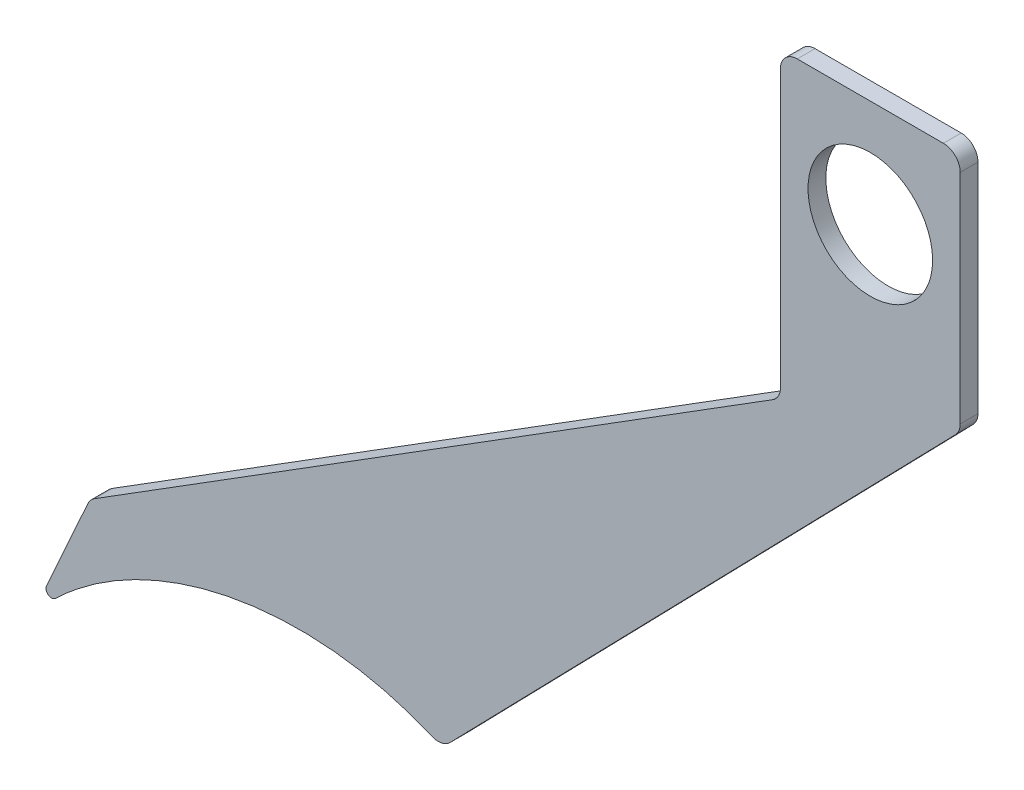
ISO-10303-21;
HEADER;
FILE_DESCRIPTION(('STEP AP214'),'2;1');
FILE_NAME('part.step','',(''),(''),'','','');
FILE_SCHEMA(('AUTOMOTIVE_DESIGN { 1 0 10303 214 1 1 1 1 }'));
ENDSEC;
DATA;
#1=APPLICATION_CONTEXT('core data for automotive mechanical design processes');
#2=APPLICATION_PROTOCOL_DEFINITION('international standard','automotive_design',2000,#1);
#3=PRODUCT_CONTEXT('',#1,'mechanical');
#4=PRODUCT('Part','Part','',(#3));
#5=PRODUCT_RELATED_PRODUCT_CATEGORY('part','',(#4));
#6=PRODUCT_DEFINITION_FORMATION('','',#4);
#7=PRODUCT_DEFINITION_CONTEXT('part definition',#1,'design');
#8=PRODUCT_DEFINITION('design','',#6,#7);
#9=PRODUCT_DEFINITION_SHAPE('','',#8);
#10=(LENGTH_UNIT() NAMED_UNIT(*) SI_UNIT(.MILLI.,.METRE.));
#11=(NAMED_UNIT(*) PLANE_ANGLE_UNIT() SI_UNIT($,.RADIAN.));
#12=(NAMED_UNIT(*) SI_UNIT($,.STERADIAN.) SOLID_ANGLE_UNIT());
#13=UNCERTAINTY_MEASURE_WITH_UNIT(LENGTH_MEASURE(1.E-05),#10,'distance_accuracy_value','');
#14=(GEOMETRIC_REPRESENTATION_CONTEXT(3) GLOBAL_UNCERTAINTY_ASSIGNED_CONTEXT((#13)) GLOBAL_UNIT_ASSIGNED_CONTEXT((#10,
#11,#12)) REPRESENTATION_CONTEXT('',''));
#15=CARTESIAN_POINT('',(0.,0.,0.));
#16=DIRECTION('',(0.,0.,1.));
#17=DIRECTION('',(1.,0.,0.));
#18=AXIS2_PLACEMENT_3D('',#15,#16,#17);
#19=CARTESIAN_POINT('',(-175.428063611577,170.729751924111,3.175));
#20=DIRECTION('',(-0.716638154781064,0.697445162799193,0.));
#21=DIRECTION('',(-0.697445162799193,-0.716638154781064,0.));
#22=AXIS2_PLACEMENT_3D('',#19,#20,#21);
#23=PLANE('',#22);
#24=DIRECTION('',(0.697445162799193,0.716638154781064,0.));
#25=VECTOR('',#24,1.);
#26=CARTESIAN_POINT('',(-175.428063611577,170.729751924111,3.175));
#27=LINE('',#26,#25);
#28=CARTESIAN_POINT('',(-455.954665330808,-117.516660763325,3.175));
#29=VERTEX_POINT('',#28);
#30=CARTESIAN_POINT('',(-365.814715468993,-24.8961498090788,3.175));
#31=VERTEX_POINT('',#30);
#32=EDGE_CURVE('E307',#29,#31,#27,.T.);
#33=ORIENTED_EDGE('',*,*,#32,.F.);
#34=DIRECTION('',(0.,0.,1.));
#35=VECTOR('',#34,1.);
#36=CARTESIAN_POINT('',(-455.954665330808,-117.516660763325,0.));
#37=LINE('',#36,#35);
#38=CARTESIAN_POINT('',(-455.954665330808,-117.516660763325,0.));
#39=VERTEX_POINT('',#38);
#40=EDGE_CURVE('E271',#29,#39,#37,.F.);
#41=ORIENTED_EDGE('',*,*,#40,.T.);
#42=DIRECTION('',(0.697445162799193,0.716638154781064,0.));
#43=VECTOR('',#42,1.);
#44=CARTESIAN_POINT('',(-175.428063611577,170.729751924111,0.));
#45=LINE('',#44,#43);
#46=CARTESIAN_POINT('',(-365.814715468993,-24.8961498090788,0.));
#47=VERTEX_POINT('',#46);
#48=EDGE_CURVE('E412',#39,#47,#45,.T.);
#49=ORIENTED_EDGE('',*,*,#48,.T.);
#50=DIRECTION('',(0.,0.,-1.));
#51=VECTOR('',#50,1.);
#52=CARTESIAN_POINT('',(-365.814715468993,-24.8961498090789,3.175));
#53=LINE('',#52,#51);
#54=EDGE_CURVE('E268',#47,#31,#53,.F.);
#55=ORIENTED_EDGE('',*,*,#54,.T.);
#56=EDGE_LOOP('',(#33,#41,#49,#55));
#57=FACE_BOUND('',#56,.T.);
#58=ADVANCED_FACE('F47',(#57),#23,.F.);
#59=CARTESIAN_POINT('',(-364.964629933337,0.,3.175));
#60=DIRECTION('',(-1.,0.,0.));
#61=DIRECTION('',(0.,0.,1.));
#62=AXIS2_PLACEMENT_3D('',#59,#60,#61);
#63=PLANE('',#62);
#64=DIRECTION('',(0.,1.,0.));
#65=VECTOR('',#64,1.);
#66=CARTESIAN_POINT('',(-364.964629933337,0.,0.));
#67=LINE('',#66,#65);
#68=CARTESIAN_POINT('',(-364.964629933337,-22.8038143206813,0.));
#69=VERTEX_POINT('',#68);
#70=CARTESIAN_POINT('',(-364.964629933337,16.05,0.));
#71=VERTEX_POINT('',#70);
#72=EDGE_CURVE('E214',#69,#71,#67,.T.);
#73=ORIENTED_EDGE('',*,*,#72,.T.);
#74=DIRECTION('',(0.,0.,-1.));
#75=VECTOR('',#74,1.);
#76=CARTESIAN_POINT('',(-364.964629933337,16.05,3.175));
#77=LINE('',#76,#75);
#78=CARTESIAN_POINT('',(-364.964629933337,16.05,3.175));
#79=VERTEX_POINT('',#78);
#80=EDGE_CURVE('E265',#71,#79,#77,.F.);
#81=ORIENTED_EDGE('',*,*,#80,.T.);
#82=DIRECTION('',(0.,1.,0.));
#83=VECTOR('',#82,1.);
#84=CARTESIAN_POINT('',(-364.964629933337,0.,3.175));
#85=LINE('',#84,#83);
#86=CARTESIAN_POINT('',(-364.964629933337,-22.8038143206813,3.175));
#87=VERTEX_POINT('',#86);
#88=EDGE_CURVE('E313',#87,#79,#85,.T.);
#89=ORIENTED_EDGE('',*,*,#88,.F.);
#90=DIRECTION('',(0.,0.,-1.));
#91=VECTOR('',#90,1.);
#92=CARTESIAN_POINT('',(-364.964629933337,-22.8038143206813,3.175));
#93=LINE('',#92,#91);
#94=EDGE_CURVE('E261',#87,#69,#93,.T.);
#95=ORIENTED_EDGE('',*,*,#94,.T.);
#96=EDGE_LOOP('',(#73,#81,#89,#95));
#97=FACE_BOUND('',#96,.T.);
#98=ADVANCED_FACE('F359',(#97),#63,.F.);
#99=CARTESIAN_POINT('',(0.,19.05,3.175));
#100=DIRECTION('',(0.,1.,0.));
#101=DIRECTION('',(0.,0.,1.));
#102=AXIS2_PLACEMENT_3D('',#99,#100,#101);
#103=PLANE('',#102);
#104=DIRECTION('',(1.,0.,0.));
#105=VECTOR('',#104,1.);
#106=CARTESIAN_POINT('',(0.,19.05,0.));
#107=LINE('',#106,#105);
#108=CARTESIAN_POINT('',(-394.035370066663,19.05,0.));
#109=VERTEX_POINT('',#108);
#110=CARTESIAN_POINT('',(-367.964629933337,19.05,0.));
#111=VERTEX_POINT('',#110);
#112=EDGE_CURVE('E206',#109,#111,#107,.T.);
#113=ORIENTED_EDGE('',*,*,#112,.F.);
#114=DIRECTION('',(0.,0.,-1.));
#115=VECTOR('',#114,1.);
#116=CARTESIAN_POINT('',(-394.035370066663,19.05,3.175));
#117=LINE('',#116,#115);
#118=CARTESIAN_POINT('',(-394.035370066663,19.05,3.175));
#119=VERTEX_POINT('',#118);
#120=EDGE_CURVE('E181',#109,#119,#117,.F.);
#121=ORIENTED_EDGE('',*,*,#120,.T.);
#122=DIRECTION('',(1.,0.,0.));
#123=VECTOR('',#122,1.);
#124=CARTESIAN_POINT('',(0.,19.05,3.175));
#125=LINE('',#124,#123);
#126=CARTESIAN_POINT('',(-367.964629933337,19.05,3.175));
#127=VERTEX_POINT('',#126);
#128=EDGE_CURVE('E303',#119,#127,#125,.T.);
#129=ORIENTED_EDGE('',*,*,#128,.T.);
#130=DIRECTION('',(0.,0.,-1.));
#131=VECTOR('',#130,1.);
#132=CARTESIAN_POINT('',(-367.964629933337,19.05,0.));
#133=LINE('',#132,#131);
#134=EDGE_CURVE('E186',#127,#111,#133,.T.);
#135=ORIENTED_EDGE('',*,*,#134,.T.);
#136=EDGE_LOOP('',(#113,#121,#129,#135));
#137=FACE_BOUND('',#136,.T.);
#138=ADVANCED_FACE('F356',(#137),#103,.T.);
#139=CARTESIAN_POINT('',(-397.035370066663,0.,3.175));
#140=DIRECTION('',(1.,0.,0.));
#141=DIRECTION('',(0.,0.,-1.));
#142=AXIS2_PLACEMENT_3D('',#139,#140,#141);
#143=PLANE('',#142);
#144=DIRECTION('',(0.,-1.,0.));
#145=VECTOR('',#144,1.);
#146=CARTESIAN_POINT('',(-397.035370066663,0.,3.175));
#147=LINE('',#146,#145);
#148=CARTESIAN_POINT('',(-397.035370066663,16.05,3.175));
#149=VERTEX_POINT('',#148);
#150=CARTESIAN_POINT('',(-397.035370066663,-33.264239688868,3.175));
#151=VERTEX_POINT('',#150);
#152=EDGE_CURVE('E196',#149,#151,#147,.T.);
#153=ORIENTED_EDGE('',*,*,#152,.F.);
#154=DIRECTION('',(0.,0.,-1.));
#155=VECTOR('',#154,1.);
#156=CARTESIAN_POINT('',(-397.035370066663,16.05,0.));
#157=LINE('',#156,#155);
#158=CARTESIAN_POINT('',(-397.035370066663,16.05,0.));
#159=VERTEX_POINT('',#158);
#160=EDGE_CURVE('E180',#149,#159,#157,.T.);
#161=ORIENTED_EDGE('',*,*,#160,.T.);
#162=DIRECTION('',(0.,-1.,0.));
#163=VECTOR('',#162,1.);
#164=CARTESIAN_POINT('',(-397.035370066663,0.,0.));
#165=LINE('',#164,#163);
#166=CARTESIAN_POINT('',(-397.035370066663,-33.264239688868,0.));
#167=VERTEX_POINT('',#166);
#168=EDGE_CURVE('E193',#159,#167,#165,.T.);
#169=ORIENTED_EDGE('',*,*,#168,.T.);
#170=DIRECTION('',(0.,0.,-1.));
#171=VECTOR('',#170,1.);
#172=CARTESIAN_POINT('',(-397.035370066663,-33.264239688868,3.175));
#173=LINE('',#172,#171);
#174=EDGE_CURVE('E199',#167,#151,#173,.F.);
#175=ORIENTED_EDGE('',*,*,#174,.T.);
#176=EDGE_LOOP('',(#153,#161,#169,#175));
#177=FACE_BOUND('',#176,.T.);
#178=ADVANCED_FACE('F192',(#177),#143,.F.);
#179=CARTESIAN_POINT('',(-96.1758508049773,153.535626141836,3.175));
#180=DIRECTION('',(0.530856347358463,-0.84746182124579,0.));
#181=DIRECTION('',(0.84746182124579,0.530856347358463,0.));
#182=AXIS2_PLACEMENT_3D('',#179,#180,#181);
#183=PLANE('',#182);
#184=DIRECTION('',(-0.84746182124579,-0.530856347358463,0.));
#185=VECTOR('',#184,1.);
#186=CARTESIAN_POINT('',(-96.1758508049773,153.535626141836,0.));
#187=LINE('',#186,#185);
#188=CARTESIAN_POINT('',(-398.442801024588,-35.8066251526054,0.));
#189=VERTEX_POINT('',#188);
#190=CARTESIAN_POINT('',(-519.4373007566,-111.598473903715,0.));
#191=VERTEX_POINT('',#190);
#192=EDGE_CURVE('E205',#189,#191,#187,.T.);
#193=ORIENTED_EDGE('',*,*,#192,.T.);
#194=DIRECTION('',(0.,0.,-1.));
#195=VECTOR('',#194,1.);
#196=CARTESIAN_POINT('',(-519.4373007566,-111.598473903715,3.175));
#197=LINE('',#196,#195);
#198=CARTESIAN_POINT('',(-519.4373007566,-111.598473903715,3.175));
#199=VERTEX_POINT('',#198);
#200=EDGE_CURVE('E286',#191,#199,#197,.F.);
#201=ORIENTED_EDGE('',*,*,#200,.T.);
#202=DIRECTION('',(-0.84746182124579,-0.530856347358463,0.));
#203=VECTOR('',#202,1.);
#204=CARTESIAN_POINT('',(-96.1758508049773,153.535626141836,3.175));
#205=LINE('',#204,#203);
#206=CARTESIAN_POINT('',(-398.442801024588,-35.8066251526054,3.175));
#207=VERTEX_POINT('',#206);
#208=EDGE_CURVE('E302',#207,#199,#205,.T.);
#209=ORIENTED_EDGE('',*,*,#208,.F.);
#210=DIRECTION('',(0.,0.,-1.));
#211=VECTOR('',#210,1.);
#212=CARTESIAN_POINT('',(-398.442801024588,-35.8066251526054,0.));
#213=LINE('',#212,#211);
#214=EDGE_CURVE('E282',#207,#189,#213,.T.);
#215=ORIENTED_EDGE('',*,*,#214,.T.);
#216=EDGE_LOOP('',(#193,#201,#209,#215));
#217=FACE_BOUND('',#216,.T.);
#218=ADVANCED_FACE('F350',(#217),#183,.F.);
#219=CARTESIAN_POINT('',(-390.705479357222,175.773527537552,3.175));
#220=DIRECTION('',(0.91195988036377,-0.410279388474364,0.));
#221=DIRECTION('',(0.410279388474364,0.91195988036377,0.));
#222=AXIS2_PLACEMENT_3D('',#219,#220,#221);
#223=PLANE('',#222);
#224=DIRECTION('',(-0.410279388474364,-0.91195988036377,0.));
#225=VECTOR('',#224,1.);
#226=CARTESIAN_POINT('',(-390.705479357222,175.773527537552,0.));
#227=LINE('',#226,#225);
#228=CARTESIAN_POINT('',(-520.580611355616,-112.910021202029,0.));
#229=VERTEX_POINT('',#228);
#230=CARTESIAN_POINT('',(-527.970979052259,-129.337165801071,0.));
#231=VERTEX_POINT('',#230);
#232=EDGE_CURVE('E211',#229,#231,#227,.T.);
#233=ORIENTED_EDGE('',*,*,#232,.T.);
#234=DIRECTION('',(0.,0.,1.));
#235=VECTOR('',#234,1.);
#236=CARTESIAN_POINT('',(-527.970979052259,-129.337165801071,3.175));
#237=LINE('',#236,#235);
#238=CARTESIAN_POINT('',(-527.970979052259,-129.337165801071,3.175));
#239=VERTEX_POINT('',#238);
#240=EDGE_CURVE('E56',#231,#239,#237,.T.);
#241=ORIENTED_EDGE('',*,*,#240,.T.);
#242=DIRECTION('',(-0.410279388474364,-0.91195988036377,0.));
#243=VECTOR('',#242,1.);
#244=CARTESIAN_POINT('',(-390.705479357222,175.773527537552,3.175));
#245=LINE('',#244,#243);
#246=CARTESIAN_POINT('',(-520.580611355616,-112.910021202029,3.175));
#247=VERTEX_POINT('',#246);
#248=EDGE_CURVE('E325',#247,#239,#245,.T.);
#249=ORIENTED_EDGE('',*,*,#248,.F.);
#250=DIRECTION('',(0.,0.,-1.));
#251=VECTOR('',#250,1.);
#252=CARTESIAN_POINT('',(-520.580611355616,-112.910021202029,3.175));
#253=LINE('',#252,#251);
#254=EDGE_CURVE('E278',#247,#229,#253,.T.);
#255=ORIENTED_EDGE('',*,*,#254,.T.);
#256=EDGE_LOOP('',(#233,#241,#249,#255));
#257=FACE_BOUND('',#256,.T.);
#258=ADVANCED_FACE('F347',(#257),#223,.F.);
#259=CARTESIAN_POINT('',(-381.,0.,3.175));
#260=DIRECTION('',(0.,0.,-1.));
#261=DIRECTION('',(-1.,0.,0.));
#262=AXIS2_PLACEMENT_3D('',#259,#260,#261);
#263=CYLINDRICAL_SURFACE('',#262,11.1125);
#264=CARTESIAN_POINT('',(-381.,0.,3.175));
#265=DIRECTION('',(0.,0.,1.));
#266=DIRECTION('',(1.,0.,0.));
#267=AXIS2_PLACEMENT_3D('',#264,#265,#266);
#268=CIRCLE('',#267,11.1125);
#269=CARTESIAN_POINT('',(-369.8875,0.,3.175));
#270=VERTEX_POINT('',#269);
#271=EDGE_CURVE('E225',#270,#270,#268,.T.);
#272=ORIENTED_EDGE('',*,*,#271,.T.);
#273=EDGE_LOOP('',(#272));
#274=FACE_BOUND('',#273,.T.);
#275=CARTESIAN_POINT('',(-381.,0.,0.));
#276=DIRECTION('',(0.,0.,1.));
#277=DIRECTION('',(1.,0.,0.));
#278=AXIS2_PLACEMENT_3D('',#275,#276,#277);
#279=CIRCLE('',#278,11.1125);
#280=CARTESIAN_POINT('',(-369.8875,0.,0.));
#281=VERTEX_POINT('',#280);
#282=EDGE_CURVE('E333',#281,#281,#279,.T.);
#283=ORIENTED_EDGE('',*,*,#282,.F.);
#284=EDGE_LOOP('',(#283));
#285=FACE_BOUND('',#284,.T.);
#286=ADVANCED_FACE('F344',(#274,#285),#263,.F.);
#287=CARTESIAN_POINT('',(-454.465143362064,-120.538477871293,3.175));
#288=CARTESIAN_POINT('',(-478.56854129889,-107.200903712447,3.175));
#289=CARTESIAN_POINT('',(-512.56888053644,-113.300398664092,3.175));
#290=CARTESIAN_POINT('',(-530.464644326867,-134.880029394474,3.175));
#291=B_SPLINE_CURVE_WITH_KNOTS('',3,(#287,#288,#289,#290),.UNSPECIFIED.,.F.,.F.,(4,4),
(0.00276825031713563,1.),.UNSPECIFIED.);
#292=DIRECTION('',(0.,0.,-1.));
#293=VECTOR('',#292,1.);
#294=SURFACE_OF_LINEAR_EXTRUSION('',#291,#293);
#295=CARTESIAN_POINT('',(-459.285594607493,-118.182078710793,3.175));
#296=VERTEX_POINT('',#295);
#297=CARTESIAN_POINT('',(-526.36536881092,-130.467757050282,3.175));
#298=VERTEX_POINT('',#297);
#299=EDGE_CURVE('E230',#296,#298,#291,.T.);
#300=ORIENTED_EDGE('',*,*,#299,.T.);
#301=DIRECTION('',(0.,0.,-1.));
#302=VECTOR('',#301,1.);
#303=CARTESIAN_POINT('',(-526.365368810911,-130.467757050274,3.175));
#304=LINE('',#303,#302);
#305=CARTESIAN_POINT('',(-526.365368810911,-130.467757050274,0.));
#306=VERTEX_POINT('',#305);
#307=EDGE_CURVE('E294',#298,#306,#304,.T.);
#308=ORIENTED_EDGE('',*,*,#307,.T.);
#309=CARTESIAN_POINT('',(-454.465143362064,-120.538477871293,0.));
#310=CARTESIAN_POINT('',(-478.56854129889,-107.200903712447,0.));
#311=CARTESIAN_POINT('',(-512.56888053644,-113.300398664092,0.));
#312=CARTESIAN_POINT('',(-530.464644326867,-134.880029394474,0.));
#313=B_SPLINE_CURVE_WITH_KNOTS('',3,(#309,#310,#311,#312),.UNSPECIFIED.,.F.,.F.,(4,4),
(0.00276825031713563,1.),.UNSPECIFIED.);
#314=CARTESIAN_POINT('',(-459.285594607493,-118.182078710793,0.));
#315=VERTEX_POINT('',#314);
#316=EDGE_CURVE('E220',#315,#306,#313,.T.);
#317=ORIENTED_EDGE('',*,*,#316,.F.);
#318=DIRECTION('',(0.,0.,-1.));
#319=VECTOR('',#318,1.);
#320=CARTESIAN_POINT('',(-459.285594607493,-118.182078710793,0.));
#321=LINE('',#320,#319);
#322=EDGE_CURVE('E275',#315,#296,#321,.F.);
#323=ORIENTED_EDGE('',*,*,#322,.T.);
#324=EDGE_LOOP('',(#300,#308,#317,#323));
#325=FACE_BOUND('',#324,.T.);
#326=ADVANCED_FACE('F339',(#325),#294,.T.);
#327=CARTESIAN_POINT('',(0.,0.,3.175));
#328=DIRECTION('',(0.,0.,1.));
#329=DIRECTION('',(1.,0.,0.));
#330=AXIS2_PLACEMENT_3D('',#327,#328,#329);
#331=PLANE('',#330);
#332=ORIENTED_EDGE('',*,*,#271,.F.);
#333=EDGE_LOOP('',(#332));
#334=FACE_BOUND('',#333,.T.);
#335=ORIENTED_EDGE('',*,*,#248,.T.);
#336=CARTESIAN_POINT('',(-527.059019171895,-129.747445189546,3.175));
#337=DIRECTION('',(0.,0.,1.));
#338=DIRECTION('',(1.,0.,0.));
#339=AXIS2_PLACEMENT_3D('',#336,#337,#338);
#340=CIRCLE('',#339,1.);
#341=EDGE_CURVE('E11',#239,#298,#340,.T.);
#342=ORIENTED_EDGE('',*,*,#341,.T.);
#343=ORIENTED_EDGE('',*,*,#299,.F.);
#344=CARTESIAN_POINT('',(-458.104579795151,-115.424325274927,3.175));
#345=DIRECTION('',(0.,0.,1.));
#346=DIRECTION('',(1.,0.,0.));
#347=AXIS2_PLACEMENT_3D('',#344,#345,#346);
#348=CIRCLE('',#347,3.);
#349=EDGE_CURVE('E253',#296,#29,#348,.T.);
#350=ORIENTED_EDGE('',*,*,#349,.T.);
#351=ORIENTED_EDGE('',*,*,#32,.T.);
#352=CARTESIAN_POINT('',(-367.964629933337,-22.8038143206813,3.175));
#353=DIRECTION('',(0.,0.,1.));
#354=DIRECTION('',(1.,0.,0.));
#355=AXIS2_PLACEMENT_3D('',#352,#353,#354);
#356=CIRCLE('',#355,3.);
#357=EDGE_CURVE('E250',#31,#87,#356,.T.);
#358=ORIENTED_EDGE('',*,*,#357,.T.);
#359=ORIENTED_EDGE('',*,*,#88,.T.);
#360=CARTESIAN_POINT('',(-367.964629933337,16.05,3.175));
#361=DIRECTION('',(0.,0.,1.));
#362=DIRECTION('',(1.,0.,0.));
#363=AXIS2_PLACEMENT_3D('',#360,#361,#362);
#364=CIRCLE('',#363,3.);
#365=EDGE_CURVE('E256',#79,#127,#364,.T.);
#366=ORIENTED_EDGE('',*,*,#365,.T.);
#367=ORIENTED_EDGE('',*,*,#128,.F.);
#368=CARTESIAN_POINT('',(-394.035370066663,16.05,3.175));
#369=DIRECTION('',(0.,0.,1.));
#370=DIRECTION('',(1.,0.,0.));
#371=AXIS2_PLACEMENT_3D('',#368,#369,#370);
#372=CIRCLE('',#371,3.);
#373=EDGE_CURVE('E259',#119,#149,#372,.T.);
#374=ORIENTED_EDGE('',*,*,#373,.T.);
#375=ORIENTED_EDGE('',*,*,#152,.T.);
#376=CARTESIAN_POINT('',(-400.035370066663,-33.264239688868,3.175));
#377=DIRECTION('',(0.,0.,1.));
#378=DIRECTION('',(1.,0.,0.));
#379=AXIS2_PLACEMENT_3D('',#376,#377,#378);
#380=CIRCLE('',#379,3.);
#381=EDGE_CURVE('E291',#151,#207,#380,.F.);
#382=ORIENTED_EDGE('',*,*,#381,.T.);
#383=ORIENTED_EDGE('',*,*,#208,.T.);
#384=CARTESIAN_POINT('',(-517.844731714525,-114.140859367452,3.175));
#385=DIRECTION('',(0.,0.,1.));
#386=DIRECTION('',(1.,0.,0.));
#387=AXIS2_PLACEMENT_3D('',#384,#385,#386);
#388=CIRCLE('',#387,3.);
#389=EDGE_CURVE('E247',#199,#247,#388,.T.);
#390=ORIENTED_EDGE('',*,*,#389,.T.);
#391=EDGE_LOOP('',(#335,#342,#343,#350,#351,#358,#359,#366,#367,#374,#375,#382,#383,#390));
#392=FACE_BOUND('',#391,.T.);
#393=ADVANCED_FACE('F343',(#334,#392),#331,.T.);
#394=CARTESIAN_POINT('',(0.,0.,0.));
#395=DIRECTION('',(0.,0.,1.));
#396=DIRECTION('',(1.,0.,0.));
#397=AXIS2_PLACEMENT_3D('',#394,#395,#396);
#398=PLANE('',#397);
#399=ORIENTED_EDGE('',*,*,#282,.T.);
#400=EDGE_LOOP('',(#399));
#401=FACE_BOUND('',#400,.T.);
#402=ORIENTED_EDGE('',*,*,#316,.T.);
#403=CARTESIAN_POINT('',(-527.059019171895,-129.747445189546,0.));
#404=DIRECTION('',(0.,0.,1.));
#405=DIRECTION('',(1.,0.,0.));
#406=AXIS2_PLACEMENT_3D('',#403,#404,#405);
#407=CIRCLE('',#406,1.);
#408=EDGE_CURVE('E74',#306,#231,#407,.F.);
#409=ORIENTED_EDGE('',*,*,#408,.T.);
#410=ORIENTED_EDGE('',*,*,#232,.F.);
#411=CARTESIAN_POINT('',(-517.844731714525,-114.140859367452,0.));
#412=DIRECTION('',(0.,0.,1.));
#413=DIRECTION('',(1.,0.,0.));
#414=AXIS2_PLACEMENT_3D('',#411,#412,#413);
#415=CIRCLE('',#414,3.);
#416=EDGE_CURVE('E198',#229,#191,#415,.F.);
#417=ORIENTED_EDGE('',*,*,#416,.T.);
#418=ORIENTED_EDGE('',*,*,#192,.F.);
#419=CARTESIAN_POINT('',(-400.035370066663,-33.264239688868,0.));
#420=DIRECTION('',(0.,0.,1.));
#421=DIRECTION('',(1.,0.,0.));
#422=AXIS2_PLACEMENT_3D('',#419,#420,#421);
#423=CIRCLE('',#422,3.);
#424=EDGE_CURVE('E203',#189,#167,#423,.T.);
#425=ORIENTED_EDGE('',*,*,#424,.T.);
#426=ORIENTED_EDGE('',*,*,#168,.F.);
#427=CARTESIAN_POINT('',(-394.035370066663,16.05,0.));
#428=DIRECTION('',(0.,0.,1.));
#429=DIRECTION('',(1.,0.,0.));
#430=AXIS2_PLACEMENT_3D('',#427,#428,#429);
#431=CIRCLE('',#430,3.);
#432=EDGE_CURVE('E176',#159,#109,#431,.F.);
#433=ORIENTED_EDGE('',*,*,#432,.T.);
#434=ORIENTED_EDGE('',*,*,#112,.T.);
#435=CARTESIAN_POINT('',(-367.964629933337,16.05,0.));
#436=DIRECTION('',(0.,0.,1.));
#437=DIRECTION('',(1.,0.,0.));
#438=AXIS2_PLACEMENT_3D('',#435,#436,#437);
#439=CIRCLE('',#438,3.);
#440=EDGE_CURVE('E187',#111,#71,#439,.F.);
#441=ORIENTED_EDGE('',*,*,#440,.T.);
#442=ORIENTED_EDGE('',*,*,#72,.F.);
#443=CARTESIAN_POINT('',(-367.964629933337,-22.8038143206813,0.));
#444=DIRECTION('',(0.,0.,1.));
#445=DIRECTION('',(1.,0.,0.));
#446=AXIS2_PLACEMENT_3D('',#443,#444,#445);
#447=CIRCLE('',#446,3.);
#448=EDGE_CURVE('E234',#69,#47,#447,.F.);
#449=ORIENTED_EDGE('',*,*,#448,.T.);
#450=ORIENTED_EDGE('',*,*,#48,.F.);
#451=CARTESIAN_POINT('',(-458.104579795151,-115.424325274927,0.));
#452=DIRECTION('',(0.,0.,1.));
#453=DIRECTION('',(1.,0.,0.));
#454=AXIS2_PLACEMENT_3D('',#451,#452,#453);
#455=CIRCLE('',#454,3.);
#456=EDGE_CURVE('E237',#39,#315,#455,.F.);
#457=ORIENTED_EDGE('',*,*,#456,.T.);
#458=EDGE_LOOP('',(#402,#409,#410,#417,#418,#425,#426,#433,#434,#441,#442,#449,#450,#457));
#459=FACE_BOUND('',#458,.T.);
#460=ADVANCED_FACE('F201',(#401,#459),#398,.F.);
#461=CARTESIAN_POINT('',(-394.035370066663,16.05,3.175));
#462=DIRECTION('',(0.,0.,1.));
#463=DIRECTION('',(1.,0.,0.));
#464=AXIS2_PLACEMENT_3D('',#461,#462,#463);
#465=CYLINDRICAL_SURFACE('',#464,3.);
#466=ORIENTED_EDGE('',*,*,#373,.F.);
#467=ORIENTED_EDGE('',*,*,#120,.F.);
#468=ORIENTED_EDGE('',*,*,#432,.F.);
#469=ORIENTED_EDGE('',*,*,#160,.F.);
#470=EDGE_LOOP('',(#466,#467,#468,#469));
#471=FACE_BOUND('',#470,.T.);
#472=ADVANCED_FACE('F179',(#471),#465,.T.);
#473=CARTESIAN_POINT('',(-367.964629933337,16.05,3.175));
#474=DIRECTION('',(0.,0.,1.));
#475=DIRECTION('',(1.,0.,0.));
#476=AXIS2_PLACEMENT_3D('',#473,#474,#475);
#477=CYLINDRICAL_SURFACE('',#476,3.);
#478=ORIENTED_EDGE('',*,*,#365,.F.);
#479=ORIENTED_EDGE('',*,*,#80,.F.);
#480=ORIENTED_EDGE('',*,*,#440,.F.);
#481=ORIENTED_EDGE('',*,*,#134,.F.);
#482=EDGE_LOOP('',(#478,#479,#480,#481));
#483=FACE_BOUND('',#482,.T.);
#484=ADVANCED_FACE('F371',(#483),#477,.T.);
#485=CARTESIAN_POINT('',(-458.104579795151,-115.424325274927,1.5875));
#486=DIRECTION('',(0.,0.,-1.));
#487=DIRECTION('',(-1.,0.,0.));
#488=AXIS2_PLACEMENT_3D('',#485,#486,#487);
#489=CYLINDRICAL_SURFACE('',#488,3.);
#490=ORIENTED_EDGE('',*,*,#349,.F.);
#491=ORIENTED_EDGE('',*,*,#322,.F.);
#492=ORIENTED_EDGE('',*,*,#456,.F.);
#493=ORIENTED_EDGE('',*,*,#40,.F.);
#494=EDGE_LOOP('',(#490,#491,#492,#493));
#495=FACE_BOUND('',#494,.T.);
#496=ADVANCED_FACE('F374',(#495),#489,.T.);
#497=CARTESIAN_POINT('',(-367.964629933337,-22.8038143206813,3.175));
#498=DIRECTION('',(0.,0.,-1.));
#499=DIRECTION('',(-1.,0.,0.));
#500=AXIS2_PLACEMENT_3D('',#497,#498,#499);
#501=CYLINDRICAL_SURFACE('',#500,3.);
#502=ORIENTED_EDGE('',*,*,#357,.F.);
#503=ORIENTED_EDGE('',*,*,#54,.F.);
#504=ORIENTED_EDGE('',*,*,#448,.F.);
#505=ORIENTED_EDGE('',*,*,#94,.F.);
#506=EDGE_LOOP('',(#502,#503,#504,#505));
#507=FACE_BOUND('',#506,.T.);
#508=ADVANCED_FACE('F378',(#507),#501,.T.);
#509=CARTESIAN_POINT('',(-517.844731714525,-114.140859367452,3.175));
#510=DIRECTION('',(0.,0.,-1.));
#511=DIRECTION('',(-1.,0.,0.));
#512=AXIS2_PLACEMENT_3D('',#509,#510,#511);
#513=CYLINDRICAL_SURFACE('',#512,3.);
#514=ORIENTED_EDGE('',*,*,#389,.F.);
#515=ORIENTED_EDGE('',*,*,#200,.F.);
#516=ORIENTED_EDGE('',*,*,#416,.F.);
#517=ORIENTED_EDGE('',*,*,#254,.F.);
#518=EDGE_LOOP('',(#514,#515,#516,#517));
#519=FACE_BOUND('',#518,.T.);
#520=ADVANCED_FACE('F382',(#519),#513,.T.);
#521=CARTESIAN_POINT('',(-400.035370066663,-33.264239688868,3.175));
#522=DIRECTION('',(0.,0.,1.));
#523=DIRECTION('',(1.,0.,0.));
#524=AXIS2_PLACEMENT_3D('',#521,#522,#523);
#525=CYLINDRICAL_SURFACE('',#524,3.);
#526=ORIENTED_EDGE('',*,*,#381,.F.);
#527=ORIENTED_EDGE('',*,*,#174,.F.);
#528=ORIENTED_EDGE('',*,*,#424,.F.);
#529=ORIENTED_EDGE('',*,*,#214,.F.);
#530=EDGE_LOOP('',(#526,#527,#528,#529));
#531=FACE_BOUND('',#530,.T.);
#532=ADVANCED_FACE('F385',(#531),#525,.F.);
#533=CARTESIAN_POINT('',(-527.059019171895,-129.747445189546,1.5875));
#534=DIRECTION('',(0.,0.,-1.));
#535=DIRECTION('',(-1.,0.,0.));
#536=AXIS2_PLACEMENT_3D('',#533,#534,#535);
#537=CYLINDRICAL_SURFACE('',#536,1.);
#538=ORIENTED_EDGE('',*,*,#341,.F.);
#539=ORIENTED_EDGE('',*,*,#240,.F.);
#540=ORIENTED_EDGE('',*,*,#408,.F.);
#541=ORIENTED_EDGE('',*,*,#307,.F.);
#542=EDGE_LOOP('',(#538,#539,#540,#541));
#543=FACE_BOUND('',#542,.T.);
#544=ADVANCED_FACE('F49',(#543),#537,.T.);
#545=CLOSED_SHELL('',(#58,#98,#138,#178,#218,#258,#286,#326,#393,#460,#472,#484,#496,#508,#520,
#532,#544));
#546=MANIFOLD_SOLID_BREP('B2',#545);
#547=ADVANCED_BREP_SHAPE_REPRESENTATION('',(#18,#546),#14);
#548=SHAPE_DEFINITION_REPRESENTATION(#9,#547);
ENDSEC;
END-ISO-10303-21;
